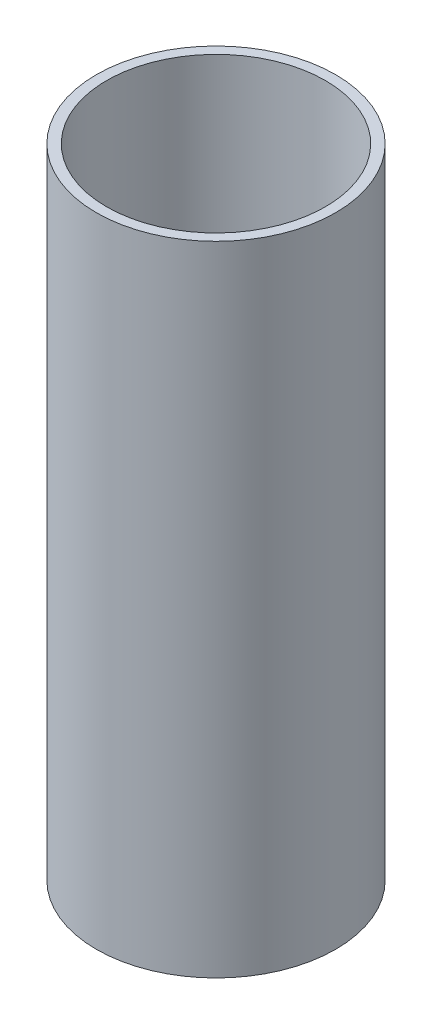
ISO-10303-21;
HEADER;
FILE_DESCRIPTION(('STEP AP214'),'2;1');
FILE_NAME('part.step','',(''),(''),'','','');
FILE_SCHEMA(('AUTOMOTIVE_DESIGN { 1 0 10303 214 1 1 1 1 }'));
ENDSEC;
DATA;
#1=APPLICATION_CONTEXT('core data for automotive mechanical design processes');
#2=APPLICATION_PROTOCOL_DEFINITION('international standard','automotive_design',2000,#1);
#3=PRODUCT_CONTEXT('',#1,'mechanical');
#4=PRODUCT('Part','Part','',(#3));
#5=PRODUCT_RELATED_PRODUCT_CATEGORY('part','',(#4));
#6=PRODUCT_DEFINITION_FORMATION('','',#4);
#7=PRODUCT_DEFINITION_CONTEXT('part definition',#1,'design');
#8=PRODUCT_DEFINITION('design','',#6,#7);
#9=PRODUCT_DEFINITION_SHAPE('','',#8);
#10=(LENGTH_UNIT() NAMED_UNIT(*) SI_UNIT(.MILLI.,.METRE.));
#11=(NAMED_UNIT(*) PLANE_ANGLE_UNIT() SI_UNIT($,.RADIAN.));
#12=(NAMED_UNIT(*) SI_UNIT($,.STERADIAN.) SOLID_ANGLE_UNIT());
#13=UNCERTAINTY_MEASURE_WITH_UNIT(LENGTH_MEASURE(1.E-05),#10,'distance_accuracy_value','');
#14=(GEOMETRIC_REPRESENTATION_CONTEXT(3) GLOBAL_UNCERTAINTY_ASSIGNED_CONTEXT((#13)) GLOBAL_UNIT_ASSIGNED_CONTEXT((#10,
#11,#12)) REPRESENTATION_CONTEXT('',''));
#15=CARTESIAN_POINT('',(0.,0.,0.));
#16=DIRECTION('',(0.,0.,1.));
#17=DIRECTION('',(1.,0.,0.));
#18=AXIS2_PLACEMENT_3D('',#15,#16,#17);
#19=CARTESIAN_POINT('',(0.,50.8,0.));
#20=DIRECTION('',(0.,-1.,0.));
#21=DIRECTION('',(0.,0.,-1.));
#22=AXIS2_PLACEMENT_3D('',#19,#20,#21);
#23=CYLINDRICAL_SURFACE('',#22,9.525);
#24=CARTESIAN_POINT('',(0.,50.8,0.));
#25=DIRECTION('',(0.,1.,0.));
#26=DIRECTION('',(0.,0.,1.));
#27=AXIS2_PLACEMENT_3D('',#24,#25,#26);
#28=CIRCLE('',#27,9.525);
#29=CARTESIAN_POINT('',(0.,50.8,9.525));
#30=VERTEX_POINT('',#29);
#31=EDGE_CURVE('E10',#30,#30,#28,.T.);
#32=ORIENTED_EDGE('',*,*,#31,.F.);
#33=EDGE_LOOP('',(#32));
#34=FACE_BOUND('',#33,.T.);
#35=CARTESIAN_POINT('',(0.,0.,0.));
#36=DIRECTION('',(0.,1.,0.));
#37=DIRECTION('',(0.,0.,1.));
#38=AXIS2_PLACEMENT_3D('',#35,#36,#37);
#39=CIRCLE('',#38,9.525);
#40=CARTESIAN_POINT('',(0.,0.,9.525));
#41=VERTEX_POINT('',#40);
#42=EDGE_CURVE('E35',#41,#41,#39,.T.);
#43=ORIENTED_EDGE('',*,*,#42,.T.);
#44=EDGE_LOOP('',(#43));
#45=FACE_BOUND('',#44,.T.);
#46=ADVANCED_FACE('F32',(#34,#45),#23,.T.);
#47=CARTESIAN_POINT('',(0.,50.8,0.));
#48=DIRECTION('',(0.,1.,0.));
#49=DIRECTION('',(0.,0.,1.));
#50=AXIS2_PLACEMENT_3D('',#47,#48,#49);
#51=PLANE('',#50);
#52=CARTESIAN_POINT('',(0.,50.8,0.));
#53=DIRECTION('',(0.,1.,0.));
#54=DIRECTION('',(0.,0.,1.));
#55=AXIS2_PLACEMENT_3D('',#52,#53,#54);
#56=CIRCLE('',#55,8.7122);
#57=CARTESIAN_POINT('',(0.,50.8,8.7122));
#58=VERTEX_POINT('',#57);
#59=EDGE_CURVE('E44',#58,#58,#56,.T.);
#60=ORIENTED_EDGE('',*,*,#59,.F.);
#61=EDGE_LOOP('',(#60));
#62=FACE_BOUND('',#61,.T.);
#63=ORIENTED_EDGE('',*,*,#31,.T.);
#64=EDGE_LOOP('',(#63));
#65=FACE_BOUND('',#64,.T.);
#66=ADVANCED_FACE('F59',(#62,#65),#51,.T.);
#67=CARTESIAN_POINT('',(0.,0.,0.));
#68=DIRECTION('',(0.,1.,0.));
#69=DIRECTION('',(0.,0.,1.));
#70=AXIS2_PLACEMENT_3D('',#67,#68,#69);
#71=PLANE('',#70);
#72=CARTESIAN_POINT('',(0.,0.,0.));
#73=DIRECTION('',(0.,1.,0.));
#74=DIRECTION('',(0.,0.,1.));
#75=AXIS2_PLACEMENT_3D('',#72,#73,#74);
#76=CIRCLE('',#75,8.7122);
#77=CARTESIAN_POINT('',(0.,0.,8.7122));
#78=VERTEX_POINT('',#77);
#79=EDGE_CURVE('E42',#78,#78,#76,.T.);
#80=ORIENTED_EDGE('',*,*,#79,.T.);
#81=EDGE_LOOP('',(#80));
#82=FACE_BOUND('',#81,.T.);
#83=ORIENTED_EDGE('',*,*,#42,.F.);
#84=EDGE_LOOP('',(#83));
#85=FACE_BOUND('',#84,.T.);
#86=ADVANCED_FACE('F50',(#82,#85),#71,.F.);
#87=CARTESIAN_POINT('',(0.,0.,0.));
#88=DIRECTION('',(0.,1.,0.));
#89=DIRECTION('',(0.,0.,1.));
#90=AXIS2_PLACEMENT_3D('',#87,#88,#89);
#91=CYLINDRICAL_SURFACE('',#90,8.7122);
#92=ORIENTED_EDGE('',*,*,#79,.F.);
#93=EDGE_LOOP('',(#92));
#94=FACE_BOUND('',#93,.T.);
#95=ORIENTED_EDGE('',*,*,#59,.T.);
#96=EDGE_LOOP('',(#95));
#97=FACE_BOUND('',#96,.T.);
#98=ADVANCED_FACE('F53',(#94,#97),#91,.F.);
#99=CLOSED_SHELL('',(#46,#66,#86,#98));
#100=MANIFOLD_SOLID_BREP('B2',#99);
#101=ADVANCED_BREP_SHAPE_REPRESENTATION('',(#18,#100),#14);
#102=SHAPE_DEFINITION_REPRESENTATION(#9,#101);
ENDSEC;
END-ISO-10303-21;
